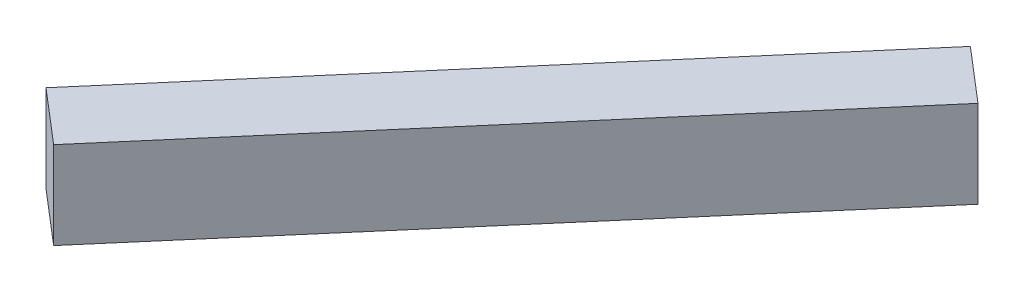
ISO-10303-21;
HEADER;
FILE_DESCRIPTION(('STEP AP214'),'2;1');
FILE_NAME('part.step','',(''),(''),'','','');
FILE_SCHEMA(('AUTOMOTIVE_DESIGN { 1 0 10303 214 1 1 1 1 }'));
ENDSEC;
DATA;
#1=APPLICATION_CONTEXT('core data for automotive mechanical design processes');
#2=APPLICATION_PROTOCOL_DEFINITION('international standard','automotive_design',2000,#1);
#3=PRODUCT_CONTEXT('',#1,'mechanical');
#4=PRODUCT('Part','Part','',(#3));
#5=PRODUCT_RELATED_PRODUCT_CATEGORY('part','',(#4));
#6=PRODUCT_DEFINITION_FORMATION('','',#4);
#7=PRODUCT_DEFINITION_CONTEXT('part definition',#1,'design');
#8=PRODUCT_DEFINITION('design','',#6,#7);
#9=PRODUCT_DEFINITION_SHAPE('','',#8);
#10=(LENGTH_UNIT() NAMED_UNIT(*) SI_UNIT(.MILLI.,.METRE.));
#11=(NAMED_UNIT(*) PLANE_ANGLE_UNIT() SI_UNIT($,.RADIAN.));
#12=(NAMED_UNIT(*) SI_UNIT($,.STERADIAN.) SOLID_ANGLE_UNIT());
#13=UNCERTAINTY_MEASURE_WITH_UNIT(LENGTH_MEASURE(1.E-05),#10,'distance_accuracy_value','');
#14=(GEOMETRIC_REPRESENTATION_CONTEXT(3) GLOBAL_UNCERTAINTY_ASSIGNED_CONTEXT((#13)) GLOBAL_UNIT_ASSIGNED_CONTEXT((#10,
#11,#12)) REPRESENTATION_CONTEXT('',''));
#15=CARTESIAN_POINT('',(0.,0.,0.));
#16=DIRECTION('',(0.,0.,1.));
#17=DIRECTION('',(1.,0.,0.));
#18=AXIS2_PLACEMENT_3D('',#15,#16,#17);
#19=CARTESIAN_POINT('',(-11.6283069853125,7.874,13.736328447559));
#20=DIRECTION('',(-0.759589244936301,0.,-0.650403089612204));
#21=DIRECTION('',(-0.650403089612204,0.,0.759589244936301));
#22=AXIS2_PLACEMENT_3D('',#19,#20,#21);
#23=PLANE('',#22);
#24=DIRECTION('',(0.,1.,0.));
#25=VECTOR('',#24,1.);
#26=CARTESIAN_POINT('',(-11.6283069853125,7.874,13.736328447559));
#27=LINE('',#26,#25);
#28=CARTESIAN_POINT('',(-11.6283069853125,7.62,13.736328447559));
#29=VERTEX_POINT('',#28);
#30=CARTESIAN_POINT('',(-11.6283069853125,7.874,13.736328447559));
#31=VERTEX_POINT('',#30);
#32=EDGE_CURVE('E20',#29,#31,#27,.T.);
#33=ORIENTED_EDGE('',*,*,#32,.T.);
#34=DIRECTION('',(-0.650403089612234,0.,0.759589244936275));
#35=VECTOR('',#34,1.);
#36=CARTESIAN_POINT('',(-11.6283069853125,7.874,13.736328447559));
#37=LINE('',#36,#35);
#38=CARTESIAN_POINT('',(-12.8673248710238,7.874,15.1833459591626));
#39=VERTEX_POINT('',#38);
#40=EDGE_CURVE('E55',#31,#39,#37,.T.);
#41=ORIENTED_EDGE('',*,*,#40,.T.);
#42=DIRECTION('',(0.,1.,0.));
#43=VECTOR('',#42,1.);
#44=CARTESIAN_POINT('',(-12.8673248710238,7.874,15.1833459591626));
#45=LINE('',#44,#43);
#46=CARTESIAN_POINT('',(-12.8673248710238,7.62,15.1833459591626));
#47=VERTEX_POINT('',#46);
#48=EDGE_CURVE('E76',#39,#47,#45,.F.);
#49=ORIENTED_EDGE('',*,*,#48,.T.);
#50=DIRECTION('',(-0.650403089612234,0.,0.759589244936275));
#51=VECTOR('',#50,1.);
#52=CARTESIAN_POINT('',(-11.6283069853125,7.62,13.736328447559));
#53=LINE('',#52,#51);
#54=EDGE_CURVE('E58',#29,#47,#53,.T.);
#55=ORIENTED_EDGE('',*,*,#54,.F.);
#56=EDGE_LOOP('',(#33,#41,#49,#55));
#57=FACE_BOUND('',#56,.T.);
#58=ADVANCED_FACE('F17',(#57),#23,.F.);
#59=CARTESIAN_POINT('',(-11.6283069853125,7.874,13.736328447559));
#60=DIRECTION('',(-0.650403089612192,0.,0.759589244936311));
#61=DIRECTION('',(0.759589244936311,0.,0.650403089612192));
#62=AXIS2_PLACEMENT_3D('',#59,#60,#61);
#63=PLANE('',#62);
#64=DIRECTION('',(0.,1.,0.));
#65=VECTOR('',#64,1.);
#66=CARTESIAN_POINT('',(-11.7826555198836,7.874,13.6041665397498));
#67=LINE('',#66,#65);
#68=CARTESIAN_POINT('',(-11.7826555198836,7.62,13.6041665397498));
#69=VERTEX_POINT('',#68);
#70=CARTESIAN_POINT('',(-11.7826555198836,7.874,13.6041665397498));
#71=VERTEX_POINT('',#70);
#72=EDGE_CURVE('E73',#69,#71,#67,.T.);
#73=ORIENTED_EDGE('',*,*,#72,.T.);
#74=DIRECTION('',(0.759589244936387,0.,0.650403089612104));
#75=VECTOR('',#74,1.);
#76=CARTESIAN_POINT('',(-11.7826555198836,7.874,13.6041665397498));
#77=LINE('',#76,#75);
#78=EDGE_CURVE('E63',#71,#31,#77,.T.);
#79=ORIENTED_EDGE('',*,*,#78,.T.);
#80=ORIENTED_EDGE('',*,*,#32,.F.);
#81=DIRECTION('',(0.759589244936387,0.,0.650403089612104));
#82=VECTOR('',#81,1.);
#83=CARTESIAN_POINT('',(-11.7826555198836,7.62,13.6041665397498));
#84=LINE('',#83,#82);
#85=EDGE_CURVE('E80',#69,#29,#84,.T.);
#86=ORIENTED_EDGE('',*,*,#85,.F.);
#87=EDGE_LOOP('',(#73,#79,#80,#86));
#88=FACE_BOUND('',#87,.T.);
#89=ADVANCED_FACE('F72',(#88),#63,.F.);
#90=CARTESIAN_POINT('',(-11.6283069853125,7.874,13.736328447559));
#91=DIRECTION('',(0.,-1.,0.));
#92=DIRECTION('',(0.,0.,-1.));
#93=AXIS2_PLACEMENT_3D('',#90,#91,#92);
#94=PLANE('',#93);
#95=ORIENTED_EDGE('',*,*,#78,.F.);
#96=DIRECTION('',(0.650403089612203,0.,-0.759589244936301));
#97=VECTOR('',#96,1.);
#98=CARTESIAN_POINT('',(-11.7826555198836,7.874,13.6041665397498));
#99=LINE('',#98,#97);
#100=CARTESIAN_POINT('',(-13.0216734057961,7.874,15.0511840515884));
#101=VERTEX_POINT('',#100);
#102=EDGE_CURVE('E83',#71,#101,#99,.F.);
#103=ORIENTED_EDGE('',*,*,#102,.T.);
#104=DIRECTION('',(-0.759589245926423,0.,-0.650403088455865));
#105=VECTOR('',#104,1.);
#106=CARTESIAN_POINT('',(-12.8673248710238,7.874,15.1833459591626));
#107=LINE('',#106,#105);
#108=EDGE_CURVE('E69',#101,#39,#107,.F.);
#109=ORIENTED_EDGE('',*,*,#108,.T.);
#110=ORIENTED_EDGE('',*,*,#40,.F.);
#111=EDGE_LOOP('',(#95,#103,#109,#110));
#112=FACE_BOUND('',#111,.T.);
#113=ADVANCED_FACE('F66',(#112),#94,.F.);
#114=CARTESIAN_POINT('',(-12.8673248710238,7.874,15.1833459591626));
#115=DIRECTION('',(0.650403088455865,0.,-0.759589245926423));
#116=DIRECTION('',(-0.759589245926423,0.,-0.650403088455865));
#117=AXIS2_PLACEMENT_3D('',#114,#115,#116);
#118=PLANE('',#117);
#119=ORIENTED_EDGE('',*,*,#48,.F.);
#120=ORIENTED_EDGE('',*,*,#108,.F.);
#121=DIRECTION('',(0.,1.,0.));
#122=VECTOR('',#121,1.);
#123=CARTESIAN_POINT('',(-13.0216734057961,7.874,15.0511840515884));
#124=LINE('',#123,#122);
#125=CARTESIAN_POINT('',(-13.0216734057961,7.62,15.0511840515884));
#126=VERTEX_POINT('',#125);
#127=EDGE_CURVE('E26',#101,#126,#124,.F.);
#128=ORIENTED_EDGE('',*,*,#127,.T.);
#129=DIRECTION('',(-0.759589245926609,0.,-0.650403088455648));
#130=VECTOR('',#129,1.);
#131=CARTESIAN_POINT('',(-12.8673248710238,7.62,15.1833459591626));
#132=LINE('',#131,#130);
#133=EDGE_CURVE('E34',#47,#126,#132,.T.);
#134=ORIENTED_EDGE('',*,*,#133,.F.);
#135=EDGE_LOOP('',(#119,#120,#128,#134));
#136=FACE_BOUND('',#135,.T.);
#137=ADVANCED_FACE('F88',(#136),#118,.F.);
#138=CARTESIAN_POINT('',(-11.6283069853125,7.62,13.736328447559));
#139=DIRECTION('',(0.,-1.,0.));
#140=DIRECTION('',(0.,0.,-1.));
#141=AXIS2_PLACEMENT_3D('',#138,#139,#140);
#142=PLANE('',#141);
#143=DIRECTION('',(0.650403089612203,0.,-0.759589244936301));
#144=VECTOR('',#143,1.);
#145=CARTESIAN_POINT('',(-11.7826555198836,7.62,13.6041665397498));
#146=LINE('',#145,#144);
#147=EDGE_CURVE('E11',#126,#69,#146,.T.);
#148=ORIENTED_EDGE('',*,*,#147,.T.);
#149=ORIENTED_EDGE('',*,*,#85,.T.);
#150=ORIENTED_EDGE('',*,*,#54,.T.);
#151=ORIENTED_EDGE('',*,*,#133,.T.);
#152=EDGE_LOOP('',(#148,#149,#150,#151));
#153=FACE_BOUND('',#152,.T.);
#154=ADVANCED_FACE('F91',(#153),#142,.T.);
#155=CARTESIAN_POINT('',(-11.7826555198836,7.874,13.6041665397498));
#156=DIRECTION('',(0.759589244936301,0.,0.650403089612203));
#157=DIRECTION('',(0.650403089612203,0.,-0.759589244936301));
#158=AXIS2_PLACEMENT_3D('',#155,#156,#157);
#159=PLANE('',#158);
#160=ORIENTED_EDGE('',*,*,#127,.F.);
#161=ORIENTED_EDGE('',*,*,#102,.F.);
#162=ORIENTED_EDGE('',*,*,#72,.F.);
#163=ORIENTED_EDGE('',*,*,#147,.F.);
#164=EDGE_LOOP('',(#160,#161,#162,#163));
#165=FACE_BOUND('',#164,.T.);
#166=ADVANCED_FACE('F90',(#165),#159,.F.);
#167=CLOSED_SHELL('',(#58,#89,#113,#137,#154,#166));
#168=MANIFOLD_SOLID_BREP('B1',#167);
#169=ADVANCED_BREP_SHAPE_REPRESENTATION('',(#18,#168),#14);
#170=SHAPE_DEFINITION_REPRESENTATION(#9,#169);
ENDSEC;
END-ISO-10303-21;
